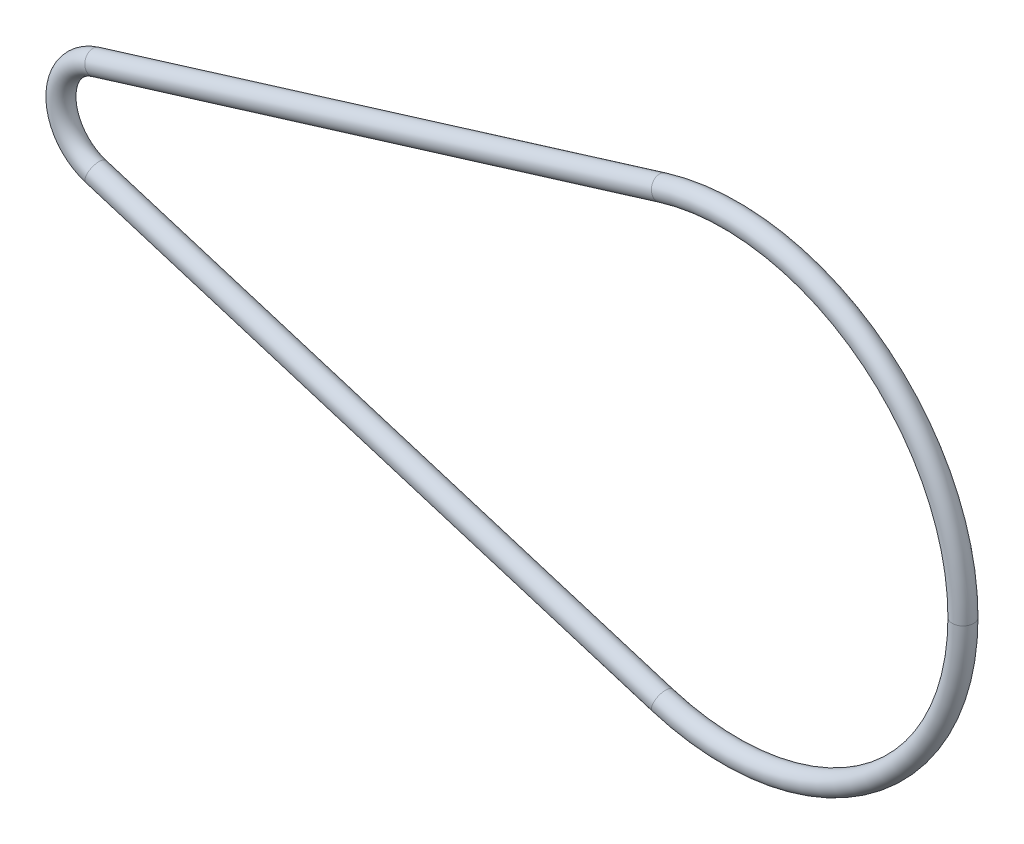
ISO-10303-21;
HEADER;
FILE_DESCRIPTION(('STEP AP214'),'2;1');
FILE_NAME('part.step','',(''),(''),'','','');
FILE_SCHEMA(('AUTOMOTIVE_DESIGN { 1 0 10303 214 1 1 1 1 }'));
ENDSEC;
DATA;
#1=APPLICATION_CONTEXT('core data for automotive mechanical design processes');
#2=APPLICATION_PROTOCOL_DEFINITION('international standard','automotive_design',2000,#1);
#3=PRODUCT_CONTEXT('',#1,'mechanical');
#4=PRODUCT('Part','Part','',(#3));
#5=PRODUCT_RELATED_PRODUCT_CATEGORY('part','',(#4));
#6=PRODUCT_DEFINITION_FORMATION('','',#4);
#7=PRODUCT_DEFINITION_CONTEXT('part definition',#1,'design');
#8=PRODUCT_DEFINITION('design','',#6,#7);
#9=PRODUCT_DEFINITION_SHAPE('','',#8);
#10=(LENGTH_UNIT() NAMED_UNIT(*) SI_UNIT(.MILLI.,.METRE.));
#11=(NAMED_UNIT(*) PLANE_ANGLE_UNIT() SI_UNIT($,.RADIAN.));
#12=(NAMED_UNIT(*) SI_UNIT($,.STERADIAN.) SOLID_ANGLE_UNIT());
#13=UNCERTAINTY_MEASURE_WITH_UNIT(LENGTH_MEASURE(1.E-05),#10,'distance_accuracy_value','');
#14=(GEOMETRIC_REPRESENTATION_CONTEXT(3) GLOBAL_UNCERTAINTY_ASSIGNED_CONTEXT((#13)) GLOBAL_UNIT_ASSIGNED_CONTEXT((#10,
#11,#12)) REPRESENTATION_CONTEXT('',''));
#15=CARTESIAN_POINT('',(0.,0.,0.));
#16=DIRECTION('',(0.,0.,1.));
#17=DIRECTION('',(1.,0.,0.));
#18=AXIS2_PLACEMENT_3D('',#15,#16,#17);
#19=CARTESIAN_POINT('',(0.,0.,0.));
#20=DIRECTION('',(0.,0.,-1.));
#21=DIRECTION('',(-1.,0.,0.));
#22=AXIS2_PLACEMENT_3D('',#19,#20,#21);
#23=TOROIDAL_SURFACE('',#22,16.637,0.761999999999999);
#24=CARTESIAN_POINT('',(16.637,0.,0.));
#25=DIRECTION('',(0.,1.,0.));
#26=DIRECTION('',(0.,0.,1.));
#27=AXIS2_PLACEMENT_3D('',#24,#25,#26);
#28=CIRCLE('',#27,0.761999999999999);
#29=CARTESIAN_POINT('',(17.399,0.,0.));
#30=VERTEX_POINT('',#29);
#31=EDGE_CURVE('E50',#30,#30,#28,.T.);
#32=CARTESIAN_POINT('',(-4.89603142857145,-15.9002718608972,0.));
#33=DIRECTION('',(0.95571748878387,-0.294285714285716,0.));
#34=DIRECTION('',(0.,0.,1.));
#35=AXIS2_PLACEMENT_3D('',#32,#33,#34);
#36=CIRCLE('',#35,0.761999999999999);
#37=CARTESIAN_POINT('',(-5.12027714285717,-16.6285285873505,0.));
#38=VERTEX_POINT('',#37);
#39=EDGE_CURVE('E45',#38,#38,#36,.T.);
#40=CARTESIAN_POINT('',(0.,0.,0.));
#41=DIRECTION('',(0.,0.,-1.));
#42=DIRECTION('',(-1.,0.,0.));
#43=AXIS2_PLACEMENT_3D('',#40,#41,#42);
#44=CIRCLE('',#43,17.399);
#45=EDGE_CURVE('',#30,#38,#44,.T.);
#46=ORIENTED_EDGE('',*,*,#31,.F.);
#47=ORIENTED_EDGE('',*,*,#39,.T.);
#48=ORIENTED_EDGE('',*,*,#45,.T.);
#49=ORIENTED_EDGE('',*,*,#45,.F.);
#50=EDGE_LOOP('',(#46,#48,#47,#49));
#51=FACE_BOUND('',#50,.T.);
#52=ADVANCED_FACE('F30',(#51),#23,.T.);
#53=CARTESIAN_POINT('',(-4.89603142857143,-15.9002718608972,0.));
#54=DIRECTION('',(-0.95571748878387,0.294285714285714,0.));
#55=DIRECTION('',(-0.294285714285714,-0.95571748878387,0.));
#56=AXIS2_PLACEMENT_3D('',#53,#54,#55);
#57=CYLINDRICAL_SURFACE('',#56,0.761999999999999);
#58=CARTESIAN_POINT('',(-45.49648,-3.39853139011544,0.));
#59=DIRECTION('',(0.95571748878387,-0.294285714285714,0.));
#60=DIRECTION('',(0.,0.,1.));
#61=AXIS2_PLACEMENT_3D('',#58,#59,#60);
#62=CIRCLE('',#61,0.761999999999999);
#63=CARTESIAN_POINT('',(-45.7207257142857,-4.12678811656875,0.));
#64=VERTEX_POINT('',#63);
#65=EDGE_CURVE('E41',#64,#64,#62,.T.);
#66=ORIENTED_EDGE('',*,*,#65,.T.);
#67=EDGE_LOOP('',(#66));
#68=FACE_BOUND('',#67,.T.);
#69=ORIENTED_EDGE('',*,*,#39,.F.);
#70=EDGE_LOOP('',(#69));
#71=FACE_BOUND('',#70,.T.);
#72=ADVANCED_FACE('F57',(#68,#71),#57,.T.);
#73=CARTESIAN_POINT('',(-44.45,0.,0.));
#74=DIRECTION('',(0.,0.,-1.));
#75=DIRECTION('',(-1.,0.,0.));
#76=AXIS2_PLACEMENT_3D('',#73,#74,#75);
#77=TOROIDAL_SURFACE('',#76,3.556,0.761999999999999);
#78=CARTESIAN_POINT('',(-45.49648,3.39853139011544,0.));
#79=DIRECTION('',(-0.95571748878387,-0.294285714285714,0.));
#80=DIRECTION('',(0.,0.,1.));
#81=AXIS2_PLACEMENT_3D('',#78,#79,#80);
#82=CIRCLE('',#81,0.761999999999999);
#83=CARTESIAN_POINT('',(-45.7207257142857,4.12678811656875,0.));
#84=VERTEX_POINT('',#83);
#85=EDGE_CURVE('E37',#84,#84,#82,.T.);
#86=CARTESIAN_POINT('',(-44.45,0.,0.));
#87=DIRECTION('',(0.,0.,-1.));
#88=DIRECTION('',(-1.,0.,0.));
#89=AXIS2_PLACEMENT_3D('',#86,#87,#88);
#90=CIRCLE('',#89,4.318);
#91=EDGE_CURVE('',#64,#84,#90,.T.);
#92=ORIENTED_EDGE('',*,*,#65,.F.);
#93=ORIENTED_EDGE('',*,*,#85,.T.);
#94=ORIENTED_EDGE('',*,*,#91,.T.);
#95=ORIENTED_EDGE('',*,*,#91,.F.);
#96=EDGE_LOOP('',(#92,#94,#93,#95));
#97=FACE_BOUND('',#96,.T.);
#98=ADVANCED_FACE('F63',(#97),#77,.T.);
#99=CARTESIAN_POINT('',(-45.49648,3.39853139011544,0.));
#100=DIRECTION('',(0.95571748878387,0.294285714285714,0.));
#101=DIRECTION('',(-0.294285714285714,0.95571748878387,0.));
#102=AXIS2_PLACEMENT_3D('',#99,#100,#101);
#103=CYLINDRICAL_SURFACE('',#102,0.761999999999999);
#104=CARTESIAN_POINT('',(-4.89603142857143,15.9002718608972,0.));
#105=DIRECTION('',(-0.95571748878387,-0.294285714285714,0.));
#106=DIRECTION('',(0.,0.,1.));
#107=AXIS2_PLACEMENT_3D('',#104,#105,#106);
#108=CIRCLE('',#107,0.761999999999999);
#109=CARTESIAN_POINT('',(-5.12027714285714,16.6285285873506,0.));
#110=VERTEX_POINT('',#109);
#111=EDGE_CURVE('E10',#110,#110,#108,.T.);
#112=ORIENTED_EDGE('',*,*,#111,.T.);
#113=EDGE_LOOP('',(#112));
#114=FACE_BOUND('',#113,.T.);
#115=ORIENTED_EDGE('',*,*,#85,.F.);
#116=EDGE_LOOP('',(#115));
#117=FACE_BOUND('',#116,.T.);
#118=ADVANCED_FACE('F68',(#114,#117),#103,.T.);
#119=CARTESIAN_POINT('',(0.,0.,0.));
#120=DIRECTION('',(0.,0.,-1.));
#121=DIRECTION('',(-1.,0.,0.));
#122=AXIS2_PLACEMENT_3D('',#119,#120,#121);
#123=TOROIDAL_SURFACE('',#122,16.637,0.761999999999999);
#124=CARTESIAN_POINT('',(0.,0.,0.));
#125=DIRECTION('',(0.,0.,-1.));
#126=DIRECTION('',(-1.,0.,0.));
#127=AXIS2_PLACEMENT_3D('',#124,#125,#126);
#128=CIRCLE('',#127,17.399);
#129=EDGE_CURVE('',#110,#30,#128,.T.);
#130=ORIENTED_EDGE('',*,*,#111,.F.);
#131=ORIENTED_EDGE('',*,*,#31,.T.);
#132=ORIENTED_EDGE('',*,*,#129,.T.);
#133=ORIENTED_EDGE('',*,*,#129,.F.);
#134=EDGE_LOOP('',(#130,#132,#131,#133));
#135=FACE_BOUND('',#134,.T.);
#136=ADVANCED_FACE('F32',(#135),#123,.T.);
#137=CLOSED_SHELL('',(#52,#72,#98,#118,#136));
#138=MANIFOLD_SOLID_BREP('B2',#137);
#139=ADVANCED_BREP_SHAPE_REPRESENTATION('',(#18,#138),#14);
#140=SHAPE_DEFINITION_REPRESENTATION(#9,#139);
ENDSEC;
END-ISO-10303-21;
